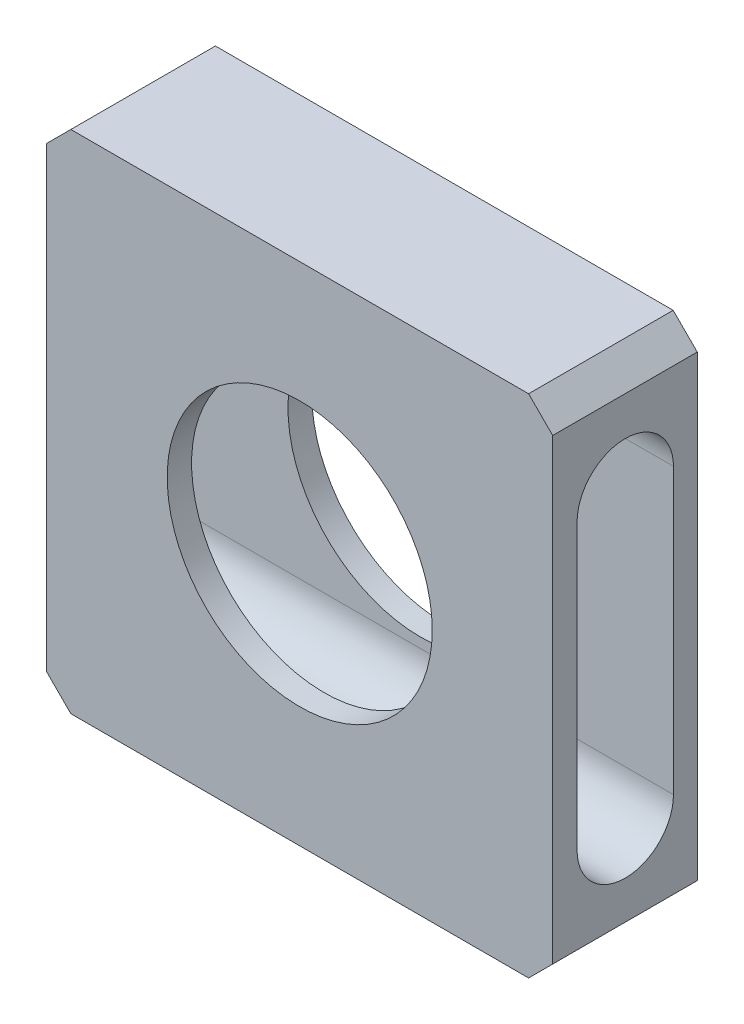
ISO-10303-21;
HEADER;
FILE_DESCRIPTION(('STEP AP214'),'2;1');
FILE_NAME('part.step','',(''),(''),'','','');
FILE_SCHEMA(('AUTOMOTIVE_DESIGN { 1 0 10303 214 1 1 1 1 }'));
ENDSEC;
DATA;
#1=APPLICATION_CONTEXT('core data for automotive mechanical design processes');
#2=APPLICATION_PROTOCOL_DEFINITION('international standard','automotive_design',2000,#1);
#3=PRODUCT_CONTEXT('',#1,'mechanical');
#4=PRODUCT('Part','Part','',(#3));
#5=PRODUCT_RELATED_PRODUCT_CATEGORY('part','',(#4));
#6=PRODUCT_DEFINITION_FORMATION('','',#4);
#7=PRODUCT_DEFINITION_CONTEXT('part definition',#1,'design');
#8=PRODUCT_DEFINITION('design','',#6,#7);
#9=PRODUCT_DEFINITION_SHAPE('','',#8);
#10=(LENGTH_UNIT() NAMED_UNIT(*) SI_UNIT(.MILLI.,.METRE.));
#11=(NAMED_UNIT(*) PLANE_ANGLE_UNIT() SI_UNIT($,.RADIAN.));
#12=(NAMED_UNIT(*) SI_UNIT($,.STERADIAN.) SOLID_ANGLE_UNIT());
#13=UNCERTAINTY_MEASURE_WITH_UNIT(LENGTH_MEASURE(1.E-05),#10,'distance_accuracy_value','');
#14=(GEOMETRIC_REPRESENTATION_CONTEXT(3) GLOBAL_UNCERTAINTY_ASSIGNED_CONTEXT((#13)) GLOBAL_UNIT_ASSIGNED_CONTEXT((#10,
#11,#12)) REPRESENTATION_CONTEXT('',''));
#15=CARTESIAN_POINT('',(0.,0.,0.));
#16=DIRECTION('',(0.,0.,1.));
#17=DIRECTION('',(1.,0.,0.));
#18=AXIS2_PLACEMENT_3D('',#15,#16,#17);
#19=CARTESIAN_POINT('',(0.,0.,12.));
#20=DIRECTION('',(0.,0.,-1.));
#21=DIRECTION('',(-1.,0.,0.));
#22=AXIS2_PLACEMENT_3D('',#19,#20,#21);
#23=CYLINDRICAL_SURFACE('',#22,11.);
#24=CARTESIAN_POINT('',(0.,0.,0.));
#25=DIRECTION('',(0.,0.,1.));
#26=DIRECTION('',(1.,0.,0.));
#27=AXIS2_PLACEMENT_3D('',#24,#25,#26);
#28=CIRCLE('',#27,11.);
#29=CARTESIAN_POINT('',(11.,0.,0.));
#30=VERTEX_POINT('',#29);
#31=EDGE_CURVE('E172',#30,#30,#28,.T.);
#32=ORIENTED_EDGE('',*,*,#31,.F.);
#33=EDGE_LOOP('',(#32));
#34=FACE_BOUND('',#33,.T.);
#35=CARTESIAN_POINT('',(0.,0.,1.97605811730234));
#36=DIRECTION('',(0.,0.,1.));
#37=DIRECTION('',(0.,-1.,0.));
#38=AXIS2_PLACEMENT_3D('',#35,#36,#37);
#39=CIRCLE('',#38,11.);
#40=CARTESIAN_POINT('',(0.,-11.,1.97605811730234));
#41=VERTEX_POINT('',#40);
#42=EDGE_CURVE('E175',#41,#41,#39,.T.);
#43=ORIENTED_EDGE('',*,*,#42,.T.);
#44=EDGE_LOOP('',(#43));
#45=FACE_BOUND('',#44,.T.);
#46=ADVANCED_FACE('F38',(#34,#45),#23,.F.);
#47=CARTESIAN_POINT('',(-21.,-21.,12.));
#48=DIRECTION('',(-1.,0.,0.));
#49=DIRECTION('',(0.,0.,1.));
#50=AXIS2_PLACEMENT_3D('',#47,#48,#49);
#51=PLANE('',#50);
#52=CARTESIAN_POINT('',(-21.,11.7702159689116,5.97605811730234));
#53=DIRECTION('',(1.,0.,0.));
#54=DIRECTION('',(0.,0.,-1.));
#55=AXIS2_PLACEMENT_3D('',#52,#53,#54);
#56=CIRCLE('',#55,4.);
#57=CARTESIAN_POINT('',(-21.,11.7702159689116,1.97605811730234));
#58=VERTEX_POINT('',#57);
#59=CARTESIAN_POINT('',(-21.,11.7702159689116,9.97605811730234));
#60=VERTEX_POINT('',#59);
#61=EDGE_CURVE('E130',#58,#60,#56,.T.);
#62=ORIENTED_EDGE('',*,*,#61,.T.);
#63=DIRECTION('',(0.,-1.,0.));
#64=VECTOR('',#63,1.);
#65=CARTESIAN_POINT('',(-21.,11.7702159689116,9.97605811730234));
#66=LINE('',#65,#64);
#67=CARTESIAN_POINT('',(-21.,-11.8297840310885,9.97605811730234));
#68=VERTEX_POINT('',#67);
#69=EDGE_CURVE('E142',#60,#68,#66,.T.);
#70=ORIENTED_EDGE('',*,*,#69,.T.);
#71=CARTESIAN_POINT('',(-21.,-11.8297840310885,5.97605811730234));
#72=DIRECTION('',(1.,0.,0.));
#73=DIRECTION('',(0.,0.,-1.));
#74=AXIS2_PLACEMENT_3D('',#71,#72,#73);
#75=CIRCLE('',#74,4.);
#76=CARTESIAN_POINT('',(-21.,-11.8297840310885,1.97605811730234));
#77=VERTEX_POINT('',#76);
#78=EDGE_CURVE('E146',#68,#77,#75,.T.);
#79=ORIENTED_EDGE('',*,*,#78,.T.);
#80=DIRECTION('',(0.,-1.,0.));
#81=VECTOR('',#80,1.);
#82=CARTESIAN_POINT('',(-21.,11.7702159689116,1.97605811730234));
#83=LINE('',#82,#81);
#84=EDGE_CURVE('E138',#58,#77,#83,.T.);
#85=ORIENTED_EDGE('',*,*,#84,.F.);
#86=EDGE_LOOP('',(#62,#70,#79,#85));
#87=FACE_BOUND('',#86,.T.);
#88=DIRECTION('',(0.,1.,0.));
#89=VECTOR('',#88,1.);
#90=CARTESIAN_POINT('',(-21.,-21.,0.));
#91=LINE('',#90,#89);
#92=CARTESIAN_POINT('',(-21.,-19.,0.));
#93=VERTEX_POINT('',#92);
#94=CARTESIAN_POINT('',(-21.,19.,0.));
#95=VERTEX_POINT('',#94);
#96=EDGE_CURVE('E171',#93,#95,#91,.T.);
#97=ORIENTED_EDGE('',*,*,#96,.F.);
#98=DIRECTION('',(0.,0.,1.));
#99=VECTOR('',#98,1.);
#100=CARTESIAN_POINT('',(-21.,-19.,12.));
#101=LINE('',#100,#99);
#102=CARTESIAN_POINT('',(-21.,-19.,12.));
#103=VERTEX_POINT('',#102);
#104=EDGE_CURVE('E47',#93,#103,#101,.T.);
#105=ORIENTED_EDGE('',*,*,#104,.T.);
#106=DIRECTION('',(0.,1.,0.));
#107=VECTOR('',#106,1.);
#108=CARTESIAN_POINT('',(-21.,-21.,12.));
#109=LINE('',#108,#107);
#110=CARTESIAN_POINT('',(-21.,19.,12.));
#111=VERTEX_POINT('',#110);
#112=EDGE_CURVE('E176',#103,#111,#109,.T.);
#113=ORIENTED_EDGE('',*,*,#112,.T.);
#114=DIRECTION('',(0.,0.,-1.));
#115=VECTOR('',#114,1.);
#116=CARTESIAN_POINT('',(-21.,19.,12.));
#117=LINE('',#116,#115);
#118=EDGE_CURVE('E188',#111,#95,#117,.T.);
#119=ORIENTED_EDGE('',*,*,#118,.T.);
#120=EDGE_LOOP('',(#97,#105,#113,#119));
#121=FACE_BOUND('',#120,.T.);
#122=ADVANCED_FACE('F148',(#87,#121),#51,.T.);
#123=CARTESIAN_POINT('',(21.,-21.,12.));
#124=DIRECTION('',(0.,-1.,0.));
#125=DIRECTION('',(0.,0.,-1.));
#126=AXIS2_PLACEMENT_3D('',#123,#124,#125);
#127=PLANE('',#126);
#128=DIRECTION('',(-1.,0.,0.));
#129=VECTOR('',#128,1.);
#130=CARTESIAN_POINT('',(21.,-21.,12.));
#131=LINE('',#130,#129);
#132=CARTESIAN_POINT('',(19.,-21.,12.));
#133=VERTEX_POINT('',#132);
#134=CARTESIAN_POINT('',(-19.,-21.,12.));
#135=VERTEX_POINT('',#134);
#136=EDGE_CURVE('E185',#133,#135,#131,.T.);
#137=ORIENTED_EDGE('',*,*,#136,.T.);
#138=DIRECTION('',(0.,0.,-1.));
#139=VECTOR('',#138,1.);
#140=CARTESIAN_POINT('',(-19.,-21.,12.));
#141=LINE('',#140,#139);
#142=CARTESIAN_POINT('',(-19.,-21.,0.));
#143=VERTEX_POINT('',#142);
#144=EDGE_CURVE('E228',#135,#143,#141,.T.);
#145=ORIENTED_EDGE('',*,*,#144,.T.);
#146=DIRECTION('',(-1.,0.,0.));
#147=VECTOR('',#146,1.);
#148=CARTESIAN_POINT('',(21.,-21.,0.));
#149=LINE('',#148,#147);
#150=CARTESIAN_POINT('',(19.,-21.,0.));
#151=VERTEX_POINT('',#150);
#152=EDGE_CURVE('E179',#151,#143,#149,.T.);
#153=ORIENTED_EDGE('',*,*,#152,.F.);
#154=DIRECTION('',(0.,0.,1.));
#155=VECTOR('',#154,1.);
#156=CARTESIAN_POINT('',(19.,-21.,12.));
#157=LINE('',#156,#155);
#158=EDGE_CURVE('E224',#151,#133,#157,.T.);
#159=ORIENTED_EDGE('',*,*,#158,.T.);
#160=EDGE_LOOP('',(#137,#145,#153,#159));
#161=FACE_BOUND('',#160,.T.);
#162=ADVANCED_FACE('F234',(#161),#127,.T.);
#163=CARTESIAN_POINT('',(21.,21.,12.));
#164=DIRECTION('',(1.,0.,0.));
#165=DIRECTION('',(0.,0.,-1.));
#166=AXIS2_PLACEMENT_3D('',#163,#164,#165);
#167=PLANE('',#166);
#168=CARTESIAN_POINT('',(21.,11.7702159689116,5.97605811730234));
#169=DIRECTION('',(1.,0.,0.));
#170=DIRECTION('',(0.,0.,-1.));
#171=AXIS2_PLACEMENT_3D('',#168,#169,#170);
#172=CIRCLE('',#171,4.);
#173=CARTESIAN_POINT('',(21.,11.7702159689116,1.97605811730234));
#174=VERTEX_POINT('',#173);
#175=CARTESIAN_POINT('',(21.,11.7702159689116,9.97605811730234));
#176=VERTEX_POINT('',#175);
#177=EDGE_CURVE('E133',#174,#176,#172,.T.);
#178=ORIENTED_EDGE('',*,*,#177,.F.);
#179=DIRECTION('',(0.,-1.,0.));
#180=VECTOR('',#179,1.);
#181=CARTESIAN_POINT('',(21.,11.7702159689116,1.97605811730234));
#182=LINE('',#181,#180);
#183=CARTESIAN_POINT('',(21.,-11.8297840310885,1.97605811730234));
#184=VERTEX_POINT('',#183);
#185=EDGE_CURVE('E149',#174,#184,#182,.T.);
#186=ORIENTED_EDGE('',*,*,#185,.T.);
#187=CARTESIAN_POINT('',(21.,-11.8297840310885,5.97605811730234));
#188=DIRECTION('',(1.,0.,0.));
#189=DIRECTION('',(0.,0.,-1.));
#190=AXIS2_PLACEMENT_3D('',#187,#188,#189);
#191=CIRCLE('',#190,4.);
#192=CARTESIAN_POINT('',(21.,-11.8297840310885,9.97605811730234));
#193=VERTEX_POINT('',#192);
#194=EDGE_CURVE('E152',#193,#184,#191,.T.);
#195=ORIENTED_EDGE('',*,*,#194,.F.);
#196=DIRECTION('',(0.,-1.,0.));
#197=VECTOR('',#196,1.);
#198=CARTESIAN_POINT('',(21.,11.7702159689116,9.97605811730234));
#199=LINE('',#198,#197);
#200=EDGE_CURVE('E158',#176,#193,#199,.T.);
#201=ORIENTED_EDGE('',*,*,#200,.F.);
#202=EDGE_LOOP('',(#178,#186,#195,#201));
#203=FACE_BOUND('',#202,.T.);
#204=DIRECTION('',(0.,-1.,0.));
#205=VECTOR('',#204,1.);
#206=CARTESIAN_POINT('',(21.,21.,12.));
#207=LINE('',#206,#205);
#208=CARTESIAN_POINT('',(21.,19.,12.));
#209=VERTEX_POINT('',#208);
#210=CARTESIAN_POINT('',(21.,-19.,12.));
#211=VERTEX_POINT('',#210);
#212=EDGE_CURVE('E182',#209,#211,#207,.T.);
#213=ORIENTED_EDGE('',*,*,#212,.T.);
#214=DIRECTION('',(0.,0.,-1.));
#215=VECTOR('',#214,1.);
#216=CARTESIAN_POINT('',(21.,-19.,12.));
#217=LINE('',#216,#215);
#218=CARTESIAN_POINT('',(21.,-19.,0.));
#219=VERTEX_POINT('',#218);
#220=EDGE_CURVE('E219',#211,#219,#217,.T.);
#221=ORIENTED_EDGE('',*,*,#220,.T.);
#222=DIRECTION('',(0.,-1.,0.));
#223=VECTOR('',#222,1.);
#224=CARTESIAN_POINT('',(21.,21.,0.));
#225=LINE('',#224,#223);
#226=CARTESIAN_POINT('',(21.,19.,0.));
#227=VERTEX_POINT('',#226);
#228=EDGE_CURVE('E193',#227,#219,#225,.T.);
#229=ORIENTED_EDGE('',*,*,#228,.F.);
#230=DIRECTION('',(0.,0.,1.));
#231=VECTOR('',#230,1.);
#232=CARTESIAN_POINT('',(21.,19.,12.));
#233=LINE('',#232,#231);
#234=EDGE_CURVE('E215',#227,#209,#233,.T.);
#235=ORIENTED_EDGE('',*,*,#234,.T.);
#236=EDGE_LOOP('',(#213,#221,#229,#235));
#237=FACE_BOUND('',#236,.T.);
#238=ADVANCED_FACE('F246',(#203,#237),#167,.T.);
#239=CARTESIAN_POINT('',(-21.,21.,12.));
#240=DIRECTION('',(0.,1.,0.));
#241=DIRECTION('',(0.,0.,1.));
#242=AXIS2_PLACEMENT_3D('',#239,#240,#241);
#243=PLANE('',#242);
#244=DIRECTION('',(1.,0.,0.));
#245=VECTOR('',#244,1.);
#246=CARTESIAN_POINT('',(-21.,21.,12.));
#247=LINE('',#246,#245);
#248=CARTESIAN_POINT('',(-19.,21.,12.));
#249=VERTEX_POINT('',#248);
#250=CARTESIAN_POINT('',(19.,21.,12.));
#251=VERTEX_POINT('',#250);
#252=EDGE_CURVE('E178',#249,#251,#247,.T.);
#253=ORIENTED_EDGE('',*,*,#252,.T.);
#254=DIRECTION('',(0.,0.,-1.));
#255=VECTOR('',#254,1.);
#256=CARTESIAN_POINT('',(19.,21.,12.));
#257=LINE('',#256,#255);
#258=CARTESIAN_POINT('',(19.,21.,0.));
#259=VERTEX_POINT('',#258);
#260=EDGE_CURVE('E210',#251,#259,#257,.T.);
#261=ORIENTED_EDGE('',*,*,#260,.T.);
#262=DIRECTION('',(1.,0.,0.));
#263=VECTOR('',#262,1.);
#264=CARTESIAN_POINT('',(-21.,21.,0.));
#265=LINE('',#264,#263);
#266=CARTESIAN_POINT('',(-19.,21.,0.));
#267=VERTEX_POINT('',#266);
#268=EDGE_CURVE('E190',#267,#259,#265,.T.);
#269=ORIENTED_EDGE('',*,*,#268,.F.);
#270=DIRECTION('',(0.,0.,1.));
#271=VECTOR('',#270,1.);
#272=CARTESIAN_POINT('',(-19.,21.,12.));
#273=LINE('',#272,#271);
#274=EDGE_CURVE('E205',#267,#249,#273,.T.);
#275=ORIENTED_EDGE('',*,*,#274,.T.);
#276=EDGE_LOOP('',(#253,#261,#269,#275));
#277=FACE_BOUND('',#276,.T.);
#278=ADVANCED_FACE('F258',(#277),#243,.T.);
#279=CARTESIAN_POINT('',(0.,0.,12.));
#280=DIRECTION('',(0.,0.,-1.));
#281=DIRECTION('',(-1.,0.,0.));
#282=AXIS2_PLACEMENT_3D('',#279,#280,#281);
#283=PLANE('',#282);
#284=CARTESIAN_POINT('',(0.,0.,12.));
#285=DIRECTION('',(0.,0.,1.));
#286=DIRECTION('',(1.,0.,0.));
#287=AXIS2_PLACEMENT_3D('',#284,#285,#286);
#288=CIRCLE('',#287,11.);
#289=CARTESIAN_POINT('',(11.,0.,12.));
#290=VERTEX_POINT('',#289);
#291=EDGE_CURVE('E168',#290,#290,#288,.T.);
#292=ORIENTED_EDGE('',*,*,#291,.F.);
#293=EDGE_LOOP('',(#292));
#294=FACE_BOUND('',#293,.T.);
#295=ORIENTED_EDGE('',*,*,#112,.F.);
#296=DIRECTION('',(-0.707106781186546,0.707106781186549,0.));
#297=VECTOR('',#296,1.);
#298=CARTESIAN_POINT('',(-19.,-21.,12.));
#299=LINE('',#298,#297);
#300=EDGE_CURVE('E11',#103,#135,#299,.F.);
#301=ORIENTED_EDGE('',*,*,#300,.T.);
#302=ORIENTED_EDGE('',*,*,#136,.F.);
#303=DIRECTION('',(-0.707106781186549,-0.707106781186546,0.));
#304=VECTOR('',#303,1.);
#305=CARTESIAN_POINT('',(21.,-19.,12.));
#306=LINE('',#305,#304);
#307=EDGE_CURVE('E226',#133,#211,#306,.F.);
#308=ORIENTED_EDGE('',*,*,#307,.T.);
#309=ORIENTED_EDGE('',*,*,#212,.F.);
#310=DIRECTION('',(0.707106781186546,-0.707106781186549,0.));
#311=VECTOR('',#310,1.);
#312=CARTESIAN_POINT('',(19.,21.,12.));
#313=LINE('',#312,#311);
#314=EDGE_CURVE('E217',#209,#251,#313,.F.);
#315=ORIENTED_EDGE('',*,*,#314,.T.);
#316=ORIENTED_EDGE('',*,*,#252,.F.);
#317=DIRECTION('',(0.707106781186549,0.707106781186546,0.));
#318=VECTOR('',#317,1.);
#319=CARTESIAN_POINT('',(-21.,19.,12.));
#320=LINE('',#319,#318);
#321=EDGE_CURVE('E207',#249,#111,#320,.F.);
#322=ORIENTED_EDGE('',*,*,#321,.T.);
#323=EDGE_LOOP('',(#295,#301,#302,#308,#309,#315,#316,#322));
#324=FACE_BOUND('',#323,.T.);
#325=ADVANCED_FACE('F251',(#294,#324),#283,.F.);
#326=CARTESIAN_POINT('',(0.,0.,0.));
#327=DIRECTION('',(0.,0.,-1.));
#328=DIRECTION('',(-1.,0.,0.));
#329=AXIS2_PLACEMENT_3D('',#326,#327,#328);
#330=PLANE('',#329);
#331=ORIENTED_EDGE('',*,*,#31,.T.);
#332=EDGE_LOOP('',(#331));
#333=FACE_BOUND('',#332,.T.);
#334=ORIENTED_EDGE('',*,*,#152,.T.);
#335=DIRECTION('',(0.707106781186546,-0.707106781186549,0.));
#336=VECTOR('',#335,1.);
#337=CARTESIAN_POINT('',(-20.,-20.,0.));
#338=LINE('',#337,#336);
#339=EDGE_CURVE('E61',#143,#93,#338,.F.);
#340=ORIENTED_EDGE('',*,*,#339,.T.);
#341=ORIENTED_EDGE('',*,*,#96,.T.);
#342=DIRECTION('',(-0.707106781186549,-0.707106781186546,0.));
#343=VECTOR('',#342,1.);
#344=CARTESIAN_POINT('',(-20.,20.,0.));
#345=LINE('',#344,#343);
#346=EDGE_CURVE('E203',#95,#267,#345,.F.);
#347=ORIENTED_EDGE('',*,*,#346,.T.);
#348=ORIENTED_EDGE('',*,*,#268,.T.);
#349=DIRECTION('',(-0.707106781186546,0.707106781186549,0.));
#350=VECTOR('',#349,1.);
#351=CARTESIAN_POINT('',(20.,20.,0.));
#352=LINE('',#351,#350);
#353=EDGE_CURVE('E213',#259,#227,#352,.F.);
#354=ORIENTED_EDGE('',*,*,#353,.T.);
#355=ORIENTED_EDGE('',*,*,#228,.T.);
#356=DIRECTION('',(0.707106781186549,0.707106781186546,0.));
#357=VECTOR('',#356,1.);
#358=CARTESIAN_POINT('',(20.,-20.,0.));
#359=LINE('',#358,#357);
#360=EDGE_CURVE('E222',#219,#151,#359,.F.);
#361=ORIENTED_EDGE('',*,*,#360,.T.);
#362=EDGE_LOOP('',(#334,#340,#341,#347,#348,#354,#355,#361));
#363=FACE_BOUND('',#362,.T.);
#364=ADVANCED_FACE('F239',(#333,#363),#330,.T.);
#365=CARTESIAN_POINT('',(0.,0.,9.97605811730234));
#366=DIRECTION('',(0.,0.,1.));
#367=DIRECTION('',(1.,0.,0.));
#368=AXIS2_PLACEMENT_3D('',#365,#366,#367);
#369=CIRCLE('',#368,11.);
#370=CARTESIAN_POINT('',(11.,0.,9.97605811730234));
#371=VERTEX_POINT('',#370);
#372=EDGE_CURVE('E164',#371,#371,#369,.T.);
#373=ORIENTED_EDGE('',*,*,#372,.F.);
#374=EDGE_LOOP('',(#373));
#375=FACE_BOUND('',#374,.T.);
#376=ORIENTED_EDGE('',*,*,#291,.T.);
#377=EDGE_LOOP('',(#376));
#378=FACE_BOUND('',#377,.T.);
#379=ADVANCED_FACE('F272',(#375,#378),#23,.F.);
#380=CARTESIAN_POINT('',(-21.,11.7702159689116,5.97605811730234));
#381=DIRECTION('',(1.,0.,0.));
#382=DIRECTION('',(0.,0.,-1.));
#383=AXIS2_PLACEMENT_3D('',#380,#381,#382);
#384=CYLINDRICAL_SURFACE('',#383,4.);
#385=ORIENTED_EDGE('',*,*,#177,.T.);
#386=DIRECTION('',(1.,0.,0.));
#387=VECTOR('',#386,1.);
#388=CARTESIAN_POINT('',(-21.,11.7702159689116,9.97605811730234));
#389=LINE('',#388,#387);
#390=EDGE_CURVE('E126',#60,#176,#389,.T.);
#391=ORIENTED_EDGE('',*,*,#390,.F.);
#392=ORIENTED_EDGE('',*,*,#61,.F.);
#393=DIRECTION('',(1.,0.,0.));
#394=VECTOR('',#393,1.);
#395=CARTESIAN_POINT('',(-21.,11.7702159689116,1.97605811730234));
#396=LINE('',#395,#394);
#397=EDGE_CURVE('E162',#58,#174,#396,.T.);
#398=ORIENTED_EDGE('',*,*,#397,.T.);
#399=EDGE_LOOP('',(#385,#391,#392,#398));
#400=FACE_BOUND('',#399,.T.);
#401=ADVANCED_FACE('F128',(#400),#384,.F.);
#402=CARTESIAN_POINT('',(-21.,11.7702159689116,1.97605811730234));
#403=DIRECTION('',(0.,0.,1.));
#404=DIRECTION('',(0.,-1.,0.));
#405=AXIS2_PLACEMENT_3D('',#402,#403,#404);
#406=PLANE('',#405);
#407=ORIENTED_EDGE('',*,*,#42,.F.);
#408=EDGE_LOOP('',(#407));
#409=FACE_BOUND('',#408,.T.);
#410=ORIENTED_EDGE('',*,*,#185,.F.);
#411=ORIENTED_EDGE('',*,*,#397,.F.);
#412=ORIENTED_EDGE('',*,*,#84,.T.);
#413=DIRECTION('',(1.,0.,0.));
#414=VECTOR('',#413,1.);
#415=CARTESIAN_POINT('',(-21.,-11.8297840310885,1.97605811730234));
#416=LINE('',#415,#414);
#417=EDGE_CURVE('E165',#77,#184,#416,.T.);
#418=ORIENTED_EDGE('',*,*,#417,.T.);
#419=EDGE_LOOP('',(#410,#411,#412,#418));
#420=FACE_BOUND('',#419,.T.);
#421=ADVANCED_FACE('F287',(#409,#420),#406,.T.);
#422=CARTESIAN_POINT('',(-21.,-11.8297840310885,5.97605811730234));
#423=DIRECTION('',(1.,0.,0.));
#424=DIRECTION('',(0.,0.,-1.));
#425=AXIS2_PLACEMENT_3D('',#422,#423,#424);
#426=CYLINDRICAL_SURFACE('',#425,4.);
#427=ORIENTED_EDGE('',*,*,#194,.T.);
#428=ORIENTED_EDGE('',*,*,#417,.F.);
#429=ORIENTED_EDGE('',*,*,#78,.F.);
#430=DIRECTION('',(1.,0.,0.));
#431=VECTOR('',#430,1.);
#432=CARTESIAN_POINT('',(-21.,-11.8297840310885,9.97605811730234));
#433=LINE('',#432,#431);
#434=EDGE_CURVE('E137',#68,#193,#433,.T.);
#435=ORIENTED_EDGE('',*,*,#434,.T.);
#436=EDGE_LOOP('',(#427,#428,#429,#435));
#437=FACE_BOUND('',#436,.T.);
#438=ADVANCED_FACE('F381',(#437),#426,.F.);
#439=CARTESIAN_POINT('',(-21.,11.7702159689116,9.97605811730234));
#440=DIRECTION('',(0.,0.,1.));
#441=DIRECTION('',(1.,0.,0.));
#442=AXIS2_PLACEMENT_3D('',#439,#440,#441);
#443=PLANE('',#442);
#444=ORIENTED_EDGE('',*,*,#372,.T.);
#445=EDGE_LOOP('',(#444));
#446=FACE_BOUND('',#445,.T.);
#447=ORIENTED_EDGE('',*,*,#200,.T.);
#448=ORIENTED_EDGE('',*,*,#434,.F.);
#449=ORIENTED_EDGE('',*,*,#69,.F.);
#450=ORIENTED_EDGE('',*,*,#390,.T.);
#451=EDGE_LOOP('',(#447,#448,#449,#450));
#452=FACE_BOUND('',#451,.T.);
#453=ADVANCED_FACE('F143',(#446,#452),#443,.F.);
#454=CARTESIAN_POINT('',(-21.,19.,12.));
#455=DIRECTION('',(0.707106781186546,-0.707106781186549,0.));
#456=DIRECTION('',(0.,0.,-1.));
#457=AXIS2_PLACEMENT_3D('',#454,#455,#456);
#458=PLANE('',#457);
#459=ORIENTED_EDGE('',*,*,#321,.F.);
#460=ORIENTED_EDGE('',*,*,#274,.F.);
#461=ORIENTED_EDGE('',*,*,#346,.F.);
#462=ORIENTED_EDGE('',*,*,#118,.F.);
#463=EDGE_LOOP('',(#459,#460,#461,#462));
#464=FACE_BOUND('',#463,.T.);
#465=ADVANCED_FACE('F264',(#464),#458,.F.);
#466=CARTESIAN_POINT('',(19.,21.,12.));
#467=DIRECTION('',(-0.707106781186549,-0.707106781186546,0.));
#468=DIRECTION('',(0.,0.,-1.));
#469=AXIS2_PLACEMENT_3D('',#466,#467,#468);
#470=PLANE('',#469);
#471=ORIENTED_EDGE('',*,*,#314,.F.);
#472=ORIENTED_EDGE('',*,*,#234,.F.);
#473=ORIENTED_EDGE('',*,*,#353,.F.);
#474=ORIENTED_EDGE('',*,*,#260,.F.);
#475=EDGE_LOOP('',(#471,#472,#473,#474));
#476=FACE_BOUND('',#475,.T.);
#477=ADVANCED_FACE('F255',(#476),#470,.F.);
#478=CARTESIAN_POINT('',(21.,-19.,12.));
#479=DIRECTION('',(-0.707106781186546,0.707106781186549,0.));
#480=DIRECTION('',(0.,0.,-1.));
#481=AXIS2_PLACEMENT_3D('',#478,#479,#480);
#482=PLANE('',#481);
#483=ORIENTED_EDGE('',*,*,#307,.F.);
#484=ORIENTED_EDGE('',*,*,#158,.F.);
#485=ORIENTED_EDGE('',*,*,#360,.F.);
#486=ORIENTED_EDGE('',*,*,#220,.F.);
#487=EDGE_LOOP('',(#483,#484,#485,#486));
#488=FACE_BOUND('',#487,.T.);
#489=ADVANCED_FACE('F244',(#488),#482,.F.);
#490=CARTESIAN_POINT('',(-19.,-21.,12.));
#491=DIRECTION('',(0.707106781186549,0.707106781186546,0.));
#492=DIRECTION('',(0.,0.,-1.));
#493=AXIS2_PLACEMENT_3D('',#490,#491,#492);
#494=PLANE('',#493);
#495=ORIENTED_EDGE('',*,*,#300,.F.);
#496=ORIENTED_EDGE('',*,*,#104,.F.);
#497=ORIENTED_EDGE('',*,*,#339,.F.);
#498=ORIENTED_EDGE('',*,*,#144,.F.);
#499=EDGE_LOOP('',(#495,#496,#497,#498));
#500=FACE_BOUND('',#499,.T.);
#501=ADVANCED_FACE('F41',(#500),#494,.F.);
#502=CLOSED_SHELL('',(#46,#122,#162,#238,#278,#325,#364,#379,#401,#421,#438,#453,#465,#477,#489,#501));
#503=MANIFOLD_SOLID_BREP('B2',#502);
#504=ADVANCED_BREP_SHAPE_REPRESENTATION('',(#18,#503),#14);
#505=SHAPE_DEFINITION_REPRESENTATION(#9,#504);
ENDSEC;
END-ISO-10303-21;
